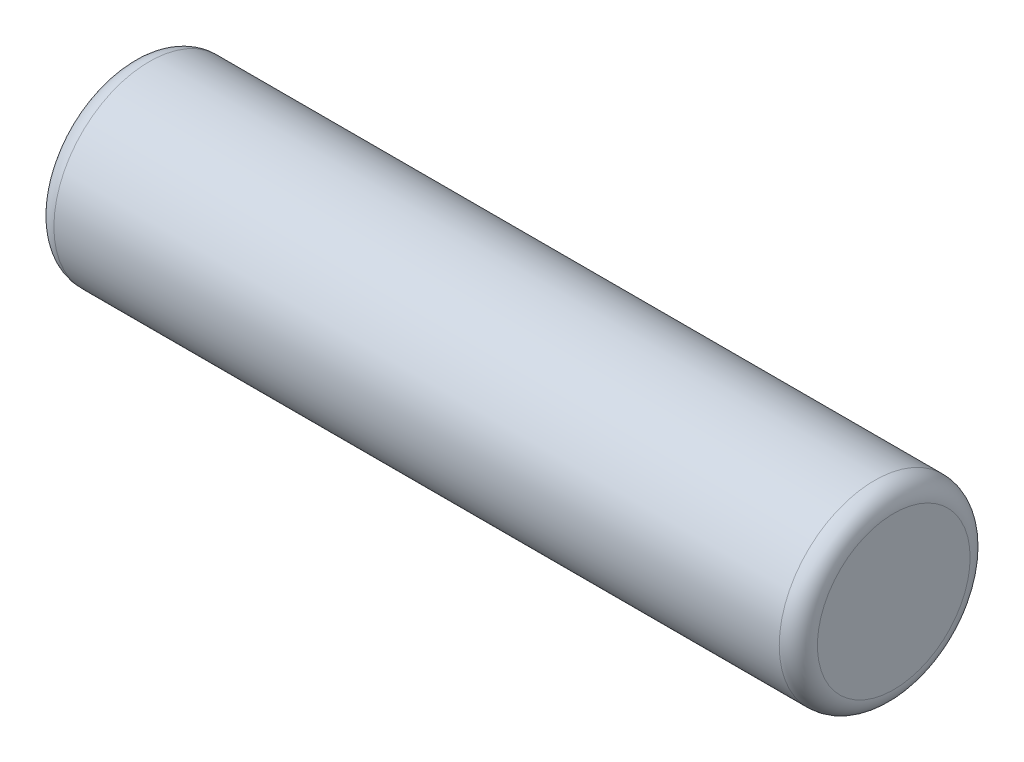
ISO-10303-21;
HEADER;
FILE_DESCRIPTION(('STEP AP214'),'2;1');
FILE_NAME('part.step','',(''),(''),'','','');
FILE_SCHEMA(('AUTOMOTIVE_DESIGN { 1 0 10303 214 1 1 1 1 }'));
ENDSEC;
DATA;
#1=APPLICATION_CONTEXT('core data for automotive mechanical design processes');
#2=APPLICATION_PROTOCOL_DEFINITION('international standard','automotive_design',2000,#1);
#3=PRODUCT_CONTEXT('',#1,'mechanical');
#4=PRODUCT('Part','Part','',(#3));
#5=PRODUCT_RELATED_PRODUCT_CATEGORY('part','',(#4));
#6=PRODUCT_DEFINITION_FORMATION('','',#4);
#7=PRODUCT_DEFINITION_CONTEXT('part definition',#1,'design');
#8=PRODUCT_DEFINITION('design','',#6,#7);
#9=PRODUCT_DEFINITION_SHAPE('','',#8);
#10=(LENGTH_UNIT() NAMED_UNIT(*) SI_UNIT(.MILLI.,.METRE.));
#11=(NAMED_UNIT(*) PLANE_ANGLE_UNIT() SI_UNIT($,.RADIAN.));
#12=(NAMED_UNIT(*) SI_UNIT($,.STERADIAN.) SOLID_ANGLE_UNIT());
#13=UNCERTAINTY_MEASURE_WITH_UNIT(LENGTH_MEASURE(1.E-05),#10,'distance_accuracy_value','');
#14=(GEOMETRIC_REPRESENTATION_CONTEXT(3) GLOBAL_UNCERTAINTY_ASSIGNED_CONTEXT((#13)) GLOBAL_UNIT_ASSIGNED_CONTEXT((#10,
#11,#12)) REPRESENTATION_CONTEXT('',''));
#15=CARTESIAN_POINT('',(0.,0.,0.));
#16=DIRECTION('',(0.,0.,1.));
#17=DIRECTION('',(1.,0.,0.));
#18=AXIS2_PLACEMENT_3D('',#15,#16,#17);
#19=CARTESIAN_POINT('',(-101.6,0.,0.));
#20=DIRECTION('',(1.,0.,0.));
#21=DIRECTION('',(0.,0.,-1.));
#22=AXIS2_PLACEMENT_3D('',#19,#20,#21);
#23=CYLINDRICAL_SURFACE('',#22,12.7);
#24=CARTESIAN_POINT('',(-99.06,0.,0.));
#25=DIRECTION('',(1.,0.,0.));
#26=DIRECTION('',(0.,0.,-1.));
#27=AXIS2_PLACEMENT_3D('',#24,#25,#26);
#28=CIRCLE('',#27,12.7);
#29=CARTESIAN_POINT('',(-99.06,0.,-12.7));
#30=VERTEX_POINT('',#29);
#31=EDGE_CURVE('E42',#30,#30,#28,.T.);
#32=ORIENTED_EDGE('',*,*,#31,.T.);
#33=EDGE_LOOP('',(#32));
#34=FACE_BOUND('',#33,.T.);
#35=CARTESIAN_POINT('',(-2.54,0.,0.));
#36=DIRECTION('',(1.,0.,0.));
#37=DIRECTION('',(0.,0.,-1.));
#38=AXIS2_PLACEMENT_3D('',#35,#36,#37);
#39=CIRCLE('',#38,12.7);
#40=CARTESIAN_POINT('',(-2.54,0.,-12.7));
#41=VERTEX_POINT('',#40);
#42=EDGE_CURVE('E46',#41,#41,#39,.F.);
#43=ORIENTED_EDGE('',*,*,#42,.T.);
#44=EDGE_LOOP('',(#43));
#45=FACE_BOUND('',#44,.T.);
#46=ADVANCED_FACE('F31',(#34,#45),#23,.T.);
#47=CARTESIAN_POINT('',(-101.6,0.,0.));
#48=DIRECTION('',(1.,0.,0.));
#49=DIRECTION('',(0.,0.,-1.));
#50=AXIS2_PLACEMENT_3D('',#47,#48,#49);
#51=PLANE('',#50);
#52=CARTESIAN_POINT('',(-101.6,0.,0.));
#53=DIRECTION('',(1.,0.,0.));
#54=DIRECTION('',(0.,0.,-1.));
#55=AXIS2_PLACEMENT_3D('',#52,#53,#54);
#56=CIRCLE('',#55,10.16);
#57=CARTESIAN_POINT('',(-101.6,0.,-10.16));
#58=VERTEX_POINT('',#57);
#59=EDGE_CURVE('E38',#58,#58,#56,.F.);
#60=ORIENTED_EDGE('',*,*,#59,.T.);
#61=EDGE_LOOP('',(#60));
#62=FACE_BOUND('',#61,.T.);
#63=ADVANCED_FACE('F62',(#62),#51,.F.);
#64=CARTESIAN_POINT('',(0.,0.,0.));
#65=DIRECTION('',(1.,0.,0.));
#66=DIRECTION('',(0.,0.,-1.));
#67=AXIS2_PLACEMENT_3D('',#64,#65,#66);
#68=PLANE('',#67);
#69=CARTESIAN_POINT('',(0.,0.,0.));
#70=DIRECTION('',(1.,0.,0.));
#71=DIRECTION('',(0.,0.,-1.));
#72=AXIS2_PLACEMENT_3D('',#69,#70,#71);
#73=CIRCLE('',#72,10.16);
#74=CARTESIAN_POINT('',(0.,0.,-10.16));
#75=VERTEX_POINT('',#74);
#76=EDGE_CURVE('E10',#75,#75,#73,.T.);
#77=ORIENTED_EDGE('',*,*,#76,.T.);
#78=EDGE_LOOP('',(#77));
#79=FACE_BOUND('',#78,.T.);
#80=ADVANCED_FACE('F59',(#79),#68,.T.);
#81=CARTESIAN_POINT('',(-99.06,0.,0.));
#82=DIRECTION('',(1.,0.,0.));
#83=DIRECTION('',(0.,0.,-1.));
#84=AXIS2_PLACEMENT_3D('',#81,#82,#83);
#85=TOROIDAL_SURFACE('',#84,10.16,2.54);
#86=ORIENTED_EDGE('',*,*,#59,.F.);
#87=EDGE_LOOP('',(#86));
#88=FACE_BOUND('',#87,.T.);
#89=ORIENTED_EDGE('',*,*,#31,.F.);
#90=EDGE_LOOP('',(#89));
#91=FACE_BOUND('',#90,.T.);
#92=ADVANCED_FACE('F55',(#88,#91),#85,.T.);
#93=CARTESIAN_POINT('',(-2.54,0.,0.));
#94=DIRECTION('',(1.,0.,0.));
#95=DIRECTION('',(0.,0.,-1.));
#96=AXIS2_PLACEMENT_3D('',#93,#94,#95);
#97=TOROIDAL_SURFACE('',#96,10.16,2.54);
#98=ORIENTED_EDGE('',*,*,#42,.F.);
#99=EDGE_LOOP('',(#98));
#100=FACE_BOUND('',#99,.T.);
#101=ORIENTED_EDGE('',*,*,#76,.F.);
#102=EDGE_LOOP('',(#101));
#103=FACE_BOUND('',#102,.T.);
#104=ADVANCED_FACE('F33',(#100,#103),#97,.T.);
#105=CLOSED_SHELL('',(#46,#63,#80,#92,#104));
#106=MANIFOLD_SOLID_BREP('B2',#105);
#107=ADVANCED_BREP_SHAPE_REPRESENTATION('',(#18,#106),#14);
#108=SHAPE_DEFINITION_REPRESENTATION(#9,#107);
ENDSEC;
END-ISO-10303-21;
